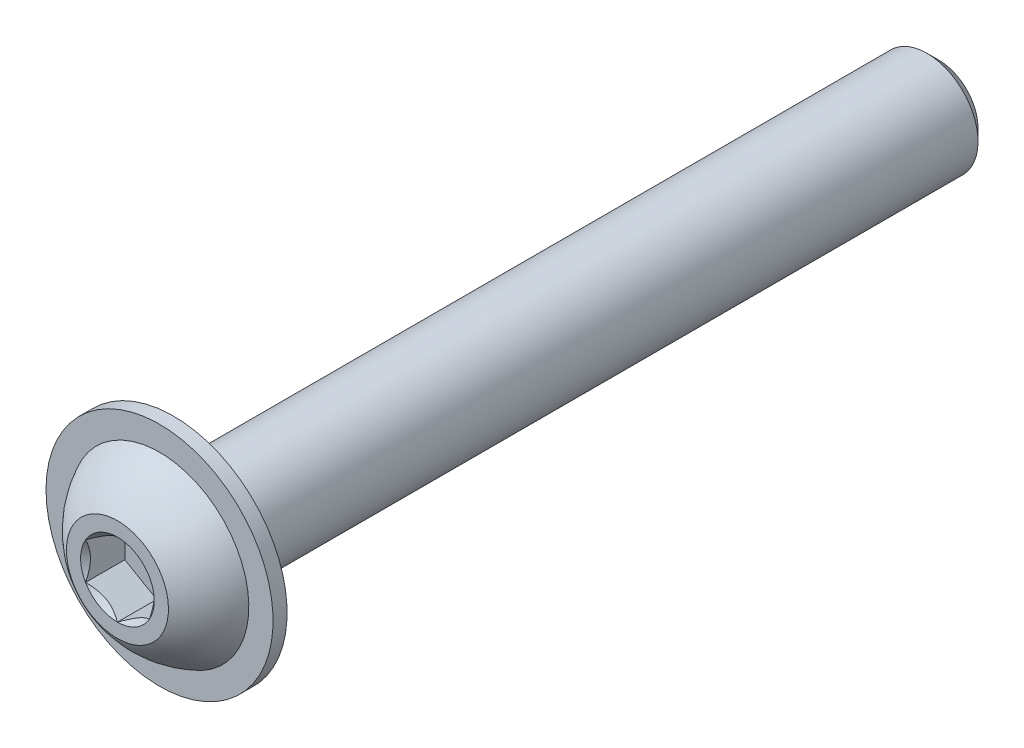
ISO-10303-21;
HEADER;
FILE_DESCRIPTION(('STEP AP214'),'2;1');
FILE_NAME('part.step','',(''),(''),'','','');
FILE_SCHEMA(('AUTOMOTIVE_DESIGN { 1 0 10303 214 1 1 1 1 }'));
ENDSEC;
DATA;
#1=APPLICATION_CONTEXT('core data for automotive mechanical design processes');
#2=APPLICATION_PROTOCOL_DEFINITION('international standard','automotive_design',2000,#1);
#3=PRODUCT_CONTEXT('',#1,'mechanical');
#4=PRODUCT('Part','Part','',(#3));
#5=PRODUCT_RELATED_PRODUCT_CATEGORY('part','',(#4));
#6=PRODUCT_DEFINITION_FORMATION('','',#4);
#7=PRODUCT_DEFINITION_CONTEXT('part definition',#1,'design');
#8=PRODUCT_DEFINITION('design','',#6,#7);
#9=PRODUCT_DEFINITION_SHAPE('','',#8);
#10=(LENGTH_UNIT() NAMED_UNIT(*) SI_UNIT(.MILLI.,.METRE.));
#11=(NAMED_UNIT(*) PLANE_ANGLE_UNIT() SI_UNIT($,.RADIAN.));
#12=(NAMED_UNIT(*) SI_UNIT($,.STERADIAN.) SOLID_ANGLE_UNIT());
#13=UNCERTAINTY_MEASURE_WITH_UNIT(LENGTH_MEASURE(1.E-05),#10,'distance_accuracy_value','');
#14=(GEOMETRIC_REPRESENTATION_CONTEXT(3) GLOBAL_UNCERTAINTY_ASSIGNED_CONTEXT((#13)) GLOBAL_UNIT_ASSIGNED_CONTEXT((#10,
#11,#12)) REPRESENTATION_CONTEXT('',''));
#15=CARTESIAN_POINT('',(0.,0.,0.));
#16=DIRECTION('',(0.,0.,1.));
#17=DIRECTION('',(1.,0.,0.));
#18=AXIS2_PLACEMENT_3D('',#15,#16,#17);
#19=CARTESIAN_POINT('',(0.,0.,-4.39999999999996));
#20=DIRECTION('',(0.,0.,-1.));
#21=DIRECTION('',(-1.,0.,0.));
#22=AXIS2_PLACEMENT_3D('',#19,#20,#21);
#23=PLANE('',#22);
#24=CARTESIAN_POINT('',(0.,0.,-4.39999999999996));
#25=DIRECTION('',(0.,0.,-1.));
#26=DIRECTION('',(-1.,0.,0.));
#27=AXIS2_PLACEMENT_3D('',#24,#25,#26);
#28=CIRCLE('',#27,8.9);
#29=CARTESIAN_POINT('',(-8.9,0.,-4.39999999999996));
#30=VERTEX_POINT('',#29);
#31=EDGE_CURVE('E134',#30,#30,#28,.T.);
#32=ORIENTED_EDGE('',*,*,#31,.T.);
#33=EDGE_LOOP('',(#32));
#34=FACE_BOUND('',#33,.T.);
#35=ADVANCED_FACE('F50',(#34),#23,.T.);
#36=CARTESIAN_POINT('',(2.49999999999994,-1.44337567297411,-3.07999999999919));
#37=DIRECTION('',(0.,0.,1.));
#38=DIRECTION('',(1.,0.,0.));
#39=AXIS2_PLACEMENT_3D('',#36,#37,#38);
#40=PLANE('',#39);
#41=DIRECTION('',(0.866025403784438,0.500000000000001,0.));
#42=VECTOR('',#41,1.);
#43=CARTESIAN_POINT('',(0.,-2.88675134594815,-3.08000000000086));
#44=LINE('',#43,#42);
#45=CARTESIAN_POINT('',(0.,-2.88675134594815,-3.08000000000086));
#46=VERTEX_POINT('',#45);
#47=CARTESIAN_POINT('',(2.49999999999994,-1.44337567297411,-3.07999999999919));
#48=VERTEX_POINT('',#47);
#49=EDGE_CURVE('E119',#46,#48,#44,.T.);
#50=ORIENTED_EDGE('',*,*,#49,.T.);
#51=DIRECTION('',(0.,0.999999999999999,0.));
#52=VECTOR('',#51,1.);
#53=CARTESIAN_POINT('',(2.49999999999994,-1.44337567297411,-3.07999999999919));
#54=LINE('',#53,#52);
#55=CARTESIAN_POINT('',(2.50000000000006,1.44337567297402,-3.08000000000086));
#56=VERTEX_POINT('',#55);
#57=EDGE_CURVE('E169',#48,#56,#54,.T.);
#58=ORIENTED_EDGE('',*,*,#57,.T.);
#59=DIRECTION('',(-0.866025403784438,0.499999999999999,0.));
#60=VECTOR('',#59,1.);
#61=CARTESIAN_POINT('',(2.50000000000006,1.44337567297402,-3.08000000000086));
#62=LINE('',#61,#60);
#63=CARTESIAN_POINT('',(0.,2.88675134594812,-3.07999999999919));
#64=VERTEX_POINT('',#63);
#65=EDGE_CURVE('E174',#56,#64,#62,.T.);
#66=ORIENTED_EDGE('',*,*,#65,.T.);
#67=DIRECTION('',(-0.866025403784439,-0.500000000000001,0.));
#68=VECTOR('',#67,1.);
#69=CARTESIAN_POINT('',(0.,2.88675134594812,-3.07999999999919));
#70=LINE('',#69,#68);
#71=CARTESIAN_POINT('',(-2.49999999999994,1.44337567297402,-3.08000000000086));
#72=VERTEX_POINT('',#71);
#73=EDGE_CURVE('E179',#64,#72,#70,.T.);
#74=ORIENTED_EDGE('',*,*,#73,.T.);
#75=DIRECTION('',(0.,-1.,0.));
#76=VECTOR('',#75,1.);
#77=CARTESIAN_POINT('',(-2.49999999999994,1.44337567297402,-3.08000000000086));
#78=LINE('',#77,#76);
#79=CARTESIAN_POINT('',(-2.50000000000006,-1.44337567297412,-3.07999999999919));
#80=VERTEX_POINT('',#79);
#81=EDGE_CURVE('E184',#72,#80,#78,.T.);
#82=ORIENTED_EDGE('',*,*,#81,.T.);
#83=DIRECTION('',(0.866025403784438,-0.499999999999999,0.));
#84=VECTOR('',#83,1.);
#85=CARTESIAN_POINT('',(-2.50000000000006,-1.44337567297412,-3.07999999999919));
#86=LINE('',#85,#84);
#87=EDGE_CURVE('E189',#80,#46,#86,.T.);
#88=ORIENTED_EDGE('',*,*,#87,.T.);
#89=EDGE_LOOP('',(#50,#58,#66,#74,#82,#88));
#90=FACE_BOUND('',#89,.T.);
#91=ADVANCED_FACE('F252',(#90),#40,.T.);
#92=CARTESIAN_POINT('',(-2.50000000000006,-1.44337567297412,-3.07999999999919));
#93=DIRECTION('',(-0.5,-0.866025403784439,0.));
#94=DIRECTION('',(0.866025403784438,-0.499999999999999,0.));
#95=AXIS2_PLACEMENT_3D('',#92,#93,#94);
#96=PLANE('',#95);
#97=DIRECTION('',(0.,0.,1.));
#98=VECTOR('',#97,1.);
#99=CARTESIAN_POINT('',(-2.50000000000006,-1.44337567297412,-3.07999999999919));
#100=LINE('',#99,#98);
#101=CARTESIAN_POINT('',(-2.50000000000006,-1.44337567297406,8.88178419700125E-13));
#102=VERTEX_POINT('',#101);
#103=EDGE_CURVE('E126',#80,#102,#100,.T.);
#104=ORIENTED_EDGE('',*,*,#103,.T.);
#105=CARTESIAN_POINT('',(-2.50020000000006,-1.44326020292023,0.000115476982642804));
#106=CARTESIAN_POINT('',(-2.41426172221242,-1.49287669073465,-0.0494592946447574));
#107=CARTESIAN_POINT('',(-2.32688643272445,-1.54332283764106,-0.0961225186372242));
#108=CARTESIAN_POINT('',(-2.14871854383449,-1.64618811625263,-0.181561859961732));
#109=CARTESIAN_POINT('',(-2.05790899931886,-1.69861703122371,-0.220290437594081));
#110=CARTESIAN_POINT('',(-1.87479587687285,-1.80433744176008,-0.286633296102172));
#111=CARTESIAN_POINT('',(-1.78253893547041,-1.85760201171341,-0.31441433146885));
#112=CARTESIAN_POINT('',(-1.59599399122351,-1.96530378549027,-0.3572168240896));
#113=CARTESIAN_POINT('',(-1.50171168743359,-2.01973769896315,-0.37227023332969));
#114=CARTESIAN_POINT('',(-1.33922174170811,-2.11355131286838,-0.385852277791261));
#115=CARTESIAN_POINT('',(-1.27122403211983,-2.15280980880349,-0.38786290075934));
#116=CARTESIAN_POINT('',(-1.1353397588308,-2.23126263056558,-0.384475882812217));
#117=CARTESIAN_POINT('',(-1.0674532424478,-2.27045692907364,-0.379075644700047));
#118=CARTESIAN_POINT('',(-0.932321211763926,-2.34847544336511,-0.361174211597508));
#119=CARTESIAN_POINT('',(-0.865076500246458,-2.3872991956613,-0.348665072953446));
#120=CARTESIAN_POINT('',(-0.7317498991818,-2.46427534467612,-0.317232498044204));
#121=CARTESIAN_POINT('',(-0.665667920900334,-2.5024277926255,-0.298309553503132));
#122=CARTESIAN_POINT('',(-0.496403653308749,-2.60015256308369,-0.242132638591765));
#123=CARTESIAN_POINT('',(-0.394270877777153,-2.65911894852994,-0.200644168403819));
#124=CARTESIAN_POINT('',(-0.244093585059642,-2.74582384890657,-0.130605953276859));
#125=CARTESIAN_POINT('',(-0.194603460117594,-2.7743969858641,-0.10599774788385));
#126=CARTESIAN_POINT('',(-0.0965399361613598,-2.83101398781789,-0.0545381132848798));
#127=CARTESIAN_POINT('',(-0.0479659965032302,-2.85905816495509,-0.0276880612209744));
#128=CARTESIAN_POINT('',(0.000200000000007486,-2.88686681600196,0.000115476980977469));
#129=B_SPLINE_CURVE_WITH_KNOTS('',3,(#105,#106,#107,#108,#109,#110,#111,#112,#113,#114,#115,
#116,#117,#118,#119,#120,#121,#122,#123,#124,#125,#126,#127,#128),.UNSPECIFIED.,.F.,.F.,(4,2,2,
2,2,2,2,2,2,2,2,4),(0.,0.333012085134134,0.667964518302078,0.997597032044016,1.32639954393906,
1.5616942414722,1.7970714210213,2.03271213522223,2.26833478775704,2.64260240809574,
2.82922877818892,3.01574133749037),.UNSPECIFIED.);
#130=CARTESIAN_POINT('',(0.,-2.88675134594812,-8.88178419700125E-13));
#131=VERTEX_POINT('',#130);
#132=EDGE_CURVE('E109',#102,#131,#129,.T.);
#133=ORIENTED_EDGE('',*,*,#132,.T.);
#134=DIRECTION('',(0.,0.,1.));
#135=VECTOR('',#134,1.);
#136=CARTESIAN_POINT('',(0.,-2.88675134594815,-3.08000000000086));
#137=LINE('',#136,#135);
#138=EDGE_CURVE('E125',#46,#131,#137,.T.);
#139=ORIENTED_EDGE('',*,*,#138,.F.);
#140=ORIENTED_EDGE('',*,*,#87,.F.);
#141=EDGE_LOOP('',(#104,#133,#139,#140));
#142=FACE_BOUND('',#141,.T.);
#143=ADVANCED_FACE('F123',(#142),#96,.F.);
#144=CARTESIAN_POINT('',(0.,-2.88675134594815,-3.08000000000086));
#145=DIRECTION('',(0.5,-0.866025403784438,0.));
#146=DIRECTION('',(0.866025403784439,0.500000000000001,0.));
#147=AXIS2_PLACEMENT_3D('',#144,#145,#146);
#148=PLANE('',#147);
#149=ORIENTED_EDGE('',*,*,#138,.T.);
#150=CARTESIAN_POINT('',(-0.000200000000004016,-2.88686681600198,0.000115476980977469));
#151=CARTESIAN_POINT('',(0.0857382777878362,-2.83725032818748,-0.0494592946456477));
#152=CARTESIAN_POINT('',(0.173113567275805,-2.78680418128109,-0.0961225186376066));
#153=CARTESIAN_POINT('',(0.351281456165468,-2.6839389026697,-0.181561859961505));
#154=CARTESIAN_POINT('',(0.442091000680801,-2.63150998769878,-0.220290437593765));
#155=CARTESIAN_POINT('',(0.625204123126512,-2.5257895771626,-0.286633296102198));
#156=CARTESIAN_POINT('',(0.717461064528956,-2.47252500720929,-0.314414331469267));
#157=CARTESIAN_POINT('',(0.904006008776035,-2.36482323343227,-0.35721682408902));
#158=CARTESIAN_POINT('',(0.998288312566142,-2.31038931995922,-0.372270233327718));
#159=CARTESIAN_POINT('',(1.16077825829178,-2.21657570605392,-0.385852277789813));
#160=CARTESIAN_POINT('',(1.22877596788008,-2.17731721011884,-0.387862900758982));
#161=CARTESIAN_POINT('',(1.36466024116917,-2.09886438835676,-0.384475882812688));
#162=CARTESIAN_POINT('',(1.43254675755221,-2.05967008984866,-0.379075644700261));
#163=CARTESIAN_POINT('',(1.56767878823603,-1.98165157555721,-0.36117421159742));
#164=CARTESIAN_POINT('',(1.63492349975341,-1.94282782326105,-0.348665072953322));
#165=CARTESIAN_POINT('',(1.76825010081808,-1.86585167424627,-0.317232498044515));
#166=CARTESIAN_POINT('',(1.83433207909964,-1.82769922629689,-0.298309553503912));
#167=CARTESIAN_POINT('',(2.00359634669133,-1.72997445583867,-0.242132638592772));
#168=CARTESIAN_POINT('',(2.10572912222276,-1.67100807039243,-0.200644168404014));
#169=CARTESIAN_POINT('',(2.25590641494045,-1.58430317001567,-0.130605953276847));
#170=CARTESIAN_POINT('',(2.30539653988266,-1.55573003305807,-0.105997747883921));
#171=CARTESIAN_POINT('',(2.40346006383899,-1.4991130311042,-0.0545381132846409));
#172=CARTESIAN_POINT('',(2.45203400349706,-1.471068853967,-0.0276880612203439));
#173=CARTESIAN_POINT('',(2.50019999999995,-1.44326020292022,0.000115476982642804));
#174=B_SPLINE_CURVE_WITH_KNOTS('',3,(#150,#151,#152,#153,#154,#155,#156,#157,#158,#159,#160,
#161,#162,#163,#164,#165,#166,#167,#168,#169,#170,#171,#172,#173),.UNSPECIFIED.,.F.,.F.,(4,2,2,
2,2,2,2,2,2,2,2,4),(0.,0.333012085133563,0.667964518300537,0.997597032042576,1.32639954393791,
1.56169424147119,1.79707142102037,2.03271213522113,2.26833478775579,2.64260240809484,
2.82922877818842,3.01574133749025),.UNSPECIFIED.);
#175=CARTESIAN_POINT('',(2.49999999999995,-1.44337567297406,8.88178419700125E-13));
#176=VERTEX_POINT('',#175);
#177=EDGE_CURVE('E115',#131,#176,#174,.T.);
#178=ORIENTED_EDGE('',*,*,#177,.T.);
#179=DIRECTION('',(0.,0.,1.));
#180=VECTOR('',#179,1.);
#181=CARTESIAN_POINT('',(2.49999999999994,-1.44337567297411,-3.07999999999919));
#182=LINE('',#181,#180);
#183=EDGE_CURVE('E72',#48,#176,#182,.T.);
#184=ORIENTED_EDGE('',*,*,#183,.F.);
#185=ORIENTED_EDGE('',*,*,#49,.F.);
#186=EDGE_LOOP('',(#149,#178,#184,#185));
#187=FACE_BOUND('',#186,.T.);
#188=ADVANCED_FACE('F130',(#187),#148,.F.);
#189=CARTESIAN_POINT('',(2.49999999999994,-1.44337567297411,-3.07999999999919));
#190=DIRECTION('',(1.,0.,0.));
#191=DIRECTION('',(0.,0.,-1.));
#192=AXIS2_PLACEMENT_3D('',#189,#190,#191);
#193=PLANE('',#192);
#194=ORIENTED_EDGE('',*,*,#183,.T.);
#195=CARTESIAN_POINT('',(2.50000000000006,-2.87868021616157,0.925964193783768));
#196=CARTESIAN_POINT('',(2.49999999999999,-2.80858751756331,0.87305476939897));
#197=CARTESIAN_POINT('',(2.49999999999996,-2.73810237384423,0.820656784806075));
#198=CARTESIAN_POINT('',(2.49999999999993,-2.59619238907427,0.71711268351496));
#199=CARTESIAN_POINT('',(2.49999999999994,-2.52476731657103,0.665966884377635));
#200=CARTESIAN_POINT('',(2.49999999999995,-2.38030019419656,0.564792497981086));
#201=CARTESIAN_POINT('',(2.49999999999994,-2.30724990359353,0.514775637784101));
#202=CARTESIAN_POINT('',(2.49999999999994,-2.1599093739724,0.416608843915115));
#203=CARTESIAN_POINT('',(2.49999999999994,-2.08561922308886,0.368458778345123));
#204=CARTESIAN_POINT('',(2.49999999999994,-1.93130274871349,0.271746559451555));
#205=CARTESIAN_POINT('',(2.49999999999994,-1.85119168497791,0.223318932536914));
#206=CARTESIAN_POINT('',(2.49999999999995,-1.68912282627113,0.129664059703774));
#207=CARTESIAN_POINT('',(2.49999999999995,-1.60716527674813,0.0844363916944372));
#208=CARTESIAN_POINT('',(2.49999999999993,-1.44137668632269,-0.00186462533096256));
#209=CARTESIAN_POINT('',(2.49999999999991,-1.35755175925743,-0.0429496273364676));
#210=CARTESIAN_POINT('',(2.49999999999997,-1.18761577759393,-0.120038133893814));
#211=CARTESIAN_POINT('',(2.50000000000006,-1.1015057792473,-0.156043939266385));
#212=CARTESIAN_POINT('',(2.50000000000005,-0.933895283730488,-0.219050255715743));
#213=CARTESIAN_POINT('',(2.49999999999997,-0.852581486652379,-0.246542279857185));
#214=CARTESIAN_POINT('',(2.49999999999992,-0.687996185051327,-0.295002885582467));
#215=CARTESIAN_POINT('',(2.49999999999994,-0.604724546085146,-0.315971017761041));
#216=CARTESIAN_POINT('',(2.49999999999994,-0.438105786501715,-0.349940004987069));
#217=CARTESIAN_POINT('',(2.49999999999991,-0.354786957377948,-0.363077366556459));
#218=CARTESIAN_POINT('',(2.49999999999997,-0.187258638268866,-0.381129805600427));
#219=CARTESIAN_POINT('',(2.50000000000006,-0.103049303891853,-0.386046296469849));
#220=CARTESIAN_POINT('',(2.50000000000005,0.0623819458554215,-0.387291925628132));
#221=CARTESIAN_POINT('',(2.49999999999997,0.143601667742384,-0.383925448289172));
#222=CARTESIAN_POINT('',(2.49999999999991,0.305344840533892,-0.369462407619159));
#223=CARTESIAN_POINT('',(2.49999999999993,0.385868223029605,-0.358365093346976));
#224=CARTESIAN_POINT('',(2.49999999999995,0.546999992477703,-0.328857921414721));
#225=CARTESIAN_POINT('',(2.49999999999994,0.627585258156358,-0.31032362316914));
#226=CARTESIAN_POINT('',(2.49999999999994,0.786991930978577,-0.266927667985993));
#227=CARTESIAN_POINT('',(2.49999999999995,0.865813485110821,-0.242066540482624));
#228=CARTESIAN_POINT('',(2.49999999999995,1.11399280220491,-0.154441088760199));
#229=CARTESIAN_POINT('',(2.49999999999994,1.27984027529457,-0.0816966645254356));
#230=CARTESIAN_POINT('',(2.49999999999994,1.52253018655039,0.0395423452677993));
#231=CARTESIAN_POINT('',(2.49999999999994,1.6025647290888,0.0820714512071594));
#232=CARTESIAN_POINT('',(2.49999999999994,1.76081489282125,0.170396524152151));
#233=CARTESIAN_POINT('',(2.49999999999994,1.83903083842888,0.216191902476673));
#234=CARTESIAN_POINT('',(2.49999999999994,1.99000684607173,0.308044678728632));
#235=CARTESIAN_POINT('',(2.49999999999994,2.06284472030453,0.353975635424464));
#236=CARTESIAN_POINT('',(2.49999999999994,2.2072716473615,0.447770245386569));
#237=CARTESIAN_POINT('',(2.49999999999994,2.2788606050042,0.495634045043718));
#238=CARTESIAN_POINT('',(2.49999999999994,2.4203707854843,0.592552236318458));
#239=CARTESIAN_POINT('',(2.49999999999994,2.49030083172911,0.641593798316324));
#240=CARTESIAN_POINT('',(2.49999999999994,2.62920524991591,0.740973835190053));
#241=CARTESIAN_POINT('',(2.49999999999994,2.69817987937865,0.79131194970785));
#242=CARTESIAN_POINT('',(2.49999999999994,2.76675463365828,0.842180297683237));
#243=B_SPLINE_CURVE_WITH_KNOTS('',3,(#195,#196,#197,#198,#199,#200,#201,#202,#203,#204,#205,
#206,#207,#208,#209,#210,#211,#212,#213,#214,#215,#216,#217,#218,#219,#220,#221,#222,#223,#224,
#225,#226,#227,#228,#229,#230,#231,#232,#233,#234,#235,#236,#237,#238,#239,#240,#241,#242),
.UNSPECIFIED.,.F.,.F.,(4,2,2,2,2,2,2,2,2,2,2,2,2,2,2,2,2,2,2,2,2,2,2,4),(0.,0.263465914971095,
0.526997968323226,0.792571943279485,1.05812711983795,1.33890112548036,1.61963802629089,
1.89956181222213,2.17935838571874,2.43663887682564,2.69393708705202,2.94660788173085,
3.19923523084959,3.44271854486734,3.68622551313313,3.93398926860529,4.18173229781925,
4.72334004841866,4.99521600381973,5.26704308216925,5.52534341671965,5.78366335141071,
6.03988492204045,6.29603603207553),.UNSPECIFIED.);
#244=CARTESIAN_POINT('',(2.50000000000006,1.44337567297406,-8.88178419700125E-13));
#245=VERTEX_POINT('',#244);
#246=EDGE_CURVE('E233',#176,#245,#243,.T.);
#247=ORIENTED_EDGE('',*,*,#246,.T.);
#248=DIRECTION('',(0.,0.,1.));
#249=VECTOR('',#248,1.);
#250=CARTESIAN_POINT('',(2.50000000000006,1.44337567297402,-3.08000000000086));
#251=LINE('',#250,#249);
#252=EDGE_CURVE('E196',#56,#245,#251,.T.);
#253=ORIENTED_EDGE('',*,*,#252,.F.);
#254=ORIENTED_EDGE('',*,*,#57,.F.);
#255=EDGE_LOOP('',(#194,#247,#253,#254));
#256=FACE_BOUND('',#255,.T.);
#257=ADVANCED_FACE('F244',(#256),#193,.F.);
#258=CARTESIAN_POINT('',(2.50000000000006,1.44337567297402,-3.08000000000086));
#259=DIRECTION('',(0.5,0.866025403784439,0.));
#260=DIRECTION('',(-0.866025403784438,0.499999999999999,0.));
#261=AXIS2_PLACEMENT_3D('',#258,#259,#260);
#262=PLANE('',#261);
#263=ORIENTED_EDGE('',*,*,#252,.T.);
#264=CARTESIAN_POINT('',(2.50020000000007,1.44326020292023,0.000115476980866447));
#265=CARTESIAN_POINT('',(2.41426172221215,1.49287669073475,-0.0494592946457352));
#266=CARTESIAN_POINT('',(2.32688643272411,1.54332283764118,-0.0961225186376951));
#267=CARTESIAN_POINT('',(2.14871854383435,1.64618811625261,-0.181561859961604));
#268=CARTESIAN_POINT('',(2.05790899931898,1.69861703122354,-0.220290437593875));
#269=CARTESIAN_POINT('',(1.87479587687328,1.80433744175974,-0.286633296102302));
#270=CARTESIAN_POINT('',(1.78253893547087,1.85760201171306,-0.314414331469361));
#271=CARTESIAN_POINT('',(1.59599399122381,1.96530378549,-0.35721682408906));
#272=CARTESIAN_POINT('',(1.50171168743367,2.01973769896296,-0.372270233327713));
#273=CARTESIAN_POINT('',(1.33922174170805,2.11355131286828,-0.385852277789819));
#274=CARTESIAN_POINT('',(1.27122403211977,2.15280980880342,-0.387862900759017));
#275=CARTESIAN_POINT('',(1.13533975883072,2.23126263056555,-0.384475882812703));
#276=CARTESIAN_POINT('',(1.06745324244768,2.27045692907362,-0.379075644700227));
#277=CARTESIAN_POINT('',(0.932321211763826,2.34847544336507,-0.361174211597474));
#278=CARTESIAN_POINT('',(0.865076500246401,2.38729919566126,-0.34866507295351));
#279=CARTESIAN_POINT('',(0.731749899181784,2.46427534467602,-0.317232498044303));
#280=CARTESIAN_POINT('',(0.665667920900319,2.50242779262536,-0.298309553503165));
#281=CARTESIAN_POINT('',(0.496403653308683,2.60015256308355,-0.242132638591685));
#282=CARTESIAN_POINT('',(0.394270877777059,2.65911894852989,-0.200644168403733));
#283=CARTESIAN_POINT('',(0.244093585059356,2.74582384890665,-0.130605953276888));
#284=CARTESIAN_POINT('',(0.194603460117203,2.77439698586422,-0.105997747883929));
#285=CARTESIAN_POINT('',(0.0965399361609544,2.83101398781804,-0.0545381132845752));
#286=CARTESIAN_POINT('',(0.0479659965029141,2.85905816495521,-0.0276880612202363));
#287=CARTESIAN_POINT('',(-0.000200000000002282,2.88686681600198,0.000115476982642804));
#288=B_SPLINE_CURVE_WITH_KNOTS('',3,(#264,#265,#266,#267,#268,#269,#270,#271,#272,#273,#274,
#275,#276,#277,#278,#279,#280,#281,#282,#283,#284,#285,#286,#287),.UNSPECIFIED.,.F.,.F.,(4,2,2,
2,2,2,2,2,2,2,2,4),(0.,0.333012085133761,0.667964518300852,0.997597032042777,1.32639954393805,
1.56169424147136,1.79707142102051,2.03271213522132,2.26833478775608,2.64260240809503,
2.82922877818846,3.01574133749022),.UNSPECIFIED.);
#289=CARTESIAN_POINT('',(0.,2.88675134594815,8.88178419700125E-13));
#290=VERTEX_POINT('',#289);
#291=EDGE_CURVE('E153',#245,#290,#288,.T.);
#292=ORIENTED_EDGE('',*,*,#291,.T.);
#293=DIRECTION('',(0.,0.,1.));
#294=VECTOR('',#293,1.);
#295=CARTESIAN_POINT('',(0.,2.88675134594812,-3.07999999999919));
#296=LINE('',#295,#294);
#297=EDGE_CURVE('E201',#64,#290,#296,.T.);
#298=ORIENTED_EDGE('',*,*,#297,.F.);
#299=ORIENTED_EDGE('',*,*,#65,.F.);
#300=EDGE_LOOP('',(#263,#292,#298,#299));
#301=FACE_BOUND('',#300,.T.);
#302=ADVANCED_FACE('F290',(#301),#262,.F.);
#303=CARTESIAN_POINT('',(0.,2.88675134594812,-3.07999999999919));
#304=DIRECTION('',(-0.5,0.866025403784438,0.));
#305=DIRECTION('',(-0.866025403784439,-0.500000000000001,0.));
#306=AXIS2_PLACEMENT_3D('',#303,#304,#305);
#307=PLANE('',#306);
#308=ORIENTED_EDGE('',*,*,#297,.T.);
#309=CARTESIAN_POINT('',(0.000200000000007486,2.88686681600198,0.000115476982642804));
#310=CARTESIAN_POINT('',(-0.0857382777876307,2.83725032818759,-0.0494592946448085));
#311=CARTESIAN_POINT('',(-0.173113567275586,2.78680418128119,-0.09612251863729));
#312=CARTESIAN_POINT('',(-0.351281456165514,2.68393890266963,-0.181561859961799));
#313=CARTESIAN_POINT('',(-0.44209100068113,2.63150998769855,-0.220290437594136));
#314=CARTESIAN_POINT('',(-0.625204123127131,2.52578957716222,-0.286633296102232));
#315=CARTESIAN_POINT('',(-0.717461064529571,2.47252500720894,-0.314414331468926));
#316=CARTESIAN_POINT('',(-0.904006008776392,2.364823233432,-0.357216824089638));
#317=CARTESIAN_POINT('',(-0.998288312566245,2.31038931995901,-0.372270233329672));
#318=CARTESIAN_POINT('',(-1.16077825829175,2.21657570605382,-0.385852277791275));
#319=CARTESIAN_POINT('',(-1.22877596788009,2.17731721011879,-0.387862900759404));
#320=CARTESIAN_POINT('',(-1.36466024116917,2.09886438835675,-0.384475882812317));
#321=CARTESIAN_POINT('',(-1.43254675755217,2.05967008984865,-0.379075644700134));
#322=CARTESIAN_POINT('',(-1.56767878823605,1.98165157555717,-0.361174211597597));
#323=CARTESIAN_POINT('',(-1.63492349975355,1.942827823261,-0.34866507295355));
#324=CARTESIAN_POINT('',(-1.76825010081819,1.86585167424612,-0.317232498044273));
#325=CARTESIAN_POINT('',(-1.83433207909961,1.82769922629666,-0.298309553503148));
#326=CARTESIAN_POINT('',(-2.00359634669117,1.72997445583843,-0.242132638591747));
#327=CARTESIAN_POINT('',(-2.10572912222285,1.67100807039229,-0.20064416840388));
#328=CARTESIAN_POINT('',(-2.25590641494038,1.58430317001571,-0.130605953276951));
#329=CARTESIAN_POINT('',(-2.30539653988243,1.55573003305819,-0.105997747883939));
#330=CARTESIAN_POINT('',(-2.40346006383863,1.49911303110436,-0.0545381132849667));
#331=CARTESIAN_POINT('',(-2.45203400349674,1.47106885396713,-0.027688061221063));
#332=CARTESIAN_POINT('',(-2.50019999999995,1.44326020292021,0.000115476980866447));
#333=B_SPLINE_CURVE_WITH_KNOTS('',3,(#309,#310,#311,#312,#313,#314,#315,#316,#317,#318,#319,
#320,#321,#322,#323,#324,#325,#326,#327,#328,#329,#330,#331,#332),.UNSPECIFIED.,.F.,.F.,(4,2,2,
2,2,2,2,2,2,2,2,4),(0.,0.333012085134117,0.667964518302013,0.997597032043898,1.32639954393891,
1.56169424147209,1.79707142102122,2.03271213522218,2.26833478775702,2.6426024080957,
2.82922877818886,3.0157413374903),.UNSPECIFIED.);
#334=CARTESIAN_POINT('',(-2.49999999999994,1.44337567297405,-8.88178419700125E-13));
#335=VERTEX_POINT('',#334);
#336=EDGE_CURVE('E157',#290,#335,#333,.T.);
#337=ORIENTED_EDGE('',*,*,#336,.T.);
#338=DIRECTION('',(0.,0.,1.));
#339=VECTOR('',#338,1.);
#340=CARTESIAN_POINT('',(-2.49999999999994,1.44337567297402,-3.08000000000086));
#341=LINE('',#340,#339);
#342=EDGE_CURVE('E206',#72,#335,#341,.T.);
#343=ORIENTED_EDGE('',*,*,#342,.F.);
#344=ORIENTED_EDGE('',*,*,#73,.F.);
#345=EDGE_LOOP('',(#308,#337,#343,#344));
#346=FACE_BOUND('',#345,.T.);
#347=ADVANCED_FACE('F286',(#346),#307,.F.);
#348=CARTESIAN_POINT('',(-2.49999999999994,1.44337567297402,-3.08000000000086));
#349=DIRECTION('',(-1.,0.,0.));
#350=DIRECTION('',(0.,-1.,0.));
#351=AXIS2_PLACEMENT_3D('',#348,#349,#350);
#352=PLANE('',#351);
#353=ORIENTED_EDGE('',*,*,#342,.T.);
#354=CARTESIAN_POINT('',(-2.49999999999994,-2.87868021616159,0.925964193783768));
#355=CARTESIAN_POINT('',(-2.49999999999994,-2.80858751756333,0.873054769398975));
#356=CARTESIAN_POINT('',(-2.49999999999994,-2.73810237384425,0.820656784806082));
#357=CARTESIAN_POINT('',(-2.49999999999994,-2.59619238907428,0.717112683514967));
#358=CARTESIAN_POINT('',(-2.49999999999994,-2.52476731657104,0.66596688437764));
#359=CARTESIAN_POINT('',(-2.49999999999994,-2.38030019419657,0.56479249798109));
#360=CARTESIAN_POINT('',(-2.49999999999994,-2.30724990359354,0.514775637784104));
#361=CARTESIAN_POINT('',(-2.49999999999994,-2.1599093739724,0.416608843915117));
#362=CARTESIAN_POINT('',(-2.49999999999994,-2.08561922308886,0.368458778345125));
#363=CARTESIAN_POINT('',(-2.49999999999994,-1.93130274871349,0.271746559451556));
#364=CARTESIAN_POINT('',(-2.49999999999994,-1.85119168497791,0.223318932536915));
#365=CARTESIAN_POINT('',(-2.49999999999994,-1.68912282627113,0.129664059703773));
#366=CARTESIAN_POINT('',(-2.49999999999994,-1.60716527674813,0.0844363916944359));
#367=CARTESIAN_POINT('',(-2.49999999999994,-1.44137668632268,-0.00186462533096573));
#368=CARTESIAN_POINT('',(-2.49999999999994,-1.35755175925742,-0.0429496273364722));
#369=CARTESIAN_POINT('',(-2.49999999999994,-1.18761577759392,-0.120038133893817));
#370=CARTESIAN_POINT('',(-2.49999999999994,-1.10150577924729,-0.156043939266385));
#371=CARTESIAN_POINT('',(-2.49999999999994,-0.933895283730474,-0.219050255715742));
#372=CARTESIAN_POINT('',(-2.49999999999994,-0.852581486652367,-0.246542279857187));
#373=CARTESIAN_POINT('',(-2.49999999999994,-0.687996185051317,-0.295002885582471));
#374=CARTESIAN_POINT('',(-2.49999999999994,-0.604724546085136,-0.315971017761044));
#375=CARTESIAN_POINT('',(-2.49999999999994,-0.438105786501706,-0.349940004987069));
#376=CARTESIAN_POINT('',(-2.49999999999994,-0.354786957377941,-0.363077366556458));
#377=CARTESIAN_POINT('',(-2.49999999999994,-0.187258638268861,-0.381129805600427));
#378=CARTESIAN_POINT('',(-2.49999999999994,-0.103049303891848,-0.38604629646985));
#379=CARTESIAN_POINT('',(-2.49999999999994,0.0623819458554237,-0.387291925628132));
#380=CARTESIAN_POINT('',(-2.49999999999994,0.143601667742385,-0.38392544828917));
#381=CARTESIAN_POINT('',(-2.49999999999994,0.30534484053389,-0.369462407619157));
#382=CARTESIAN_POINT('',(-2.49999999999994,0.385868223029602,-0.358365093346974));
#383=CARTESIAN_POINT('',(-2.49999999999994,0.546999992477698,-0.32885792141472));
#384=CARTESIAN_POINT('',(-2.49999999999994,0.627585258156352,-0.310323623169139));
#385=CARTESIAN_POINT('',(-2.49999999999994,0.786991930978569,-0.266927667985992));
#386=CARTESIAN_POINT('',(-2.49999999999994,0.865813485110812,-0.242066540482624));
#387=CARTESIAN_POINT('',(-2.49999999999995,1.1139928022049,-0.154441088760199));
#388=CARTESIAN_POINT('',(-2.49999999999994,1.27984027529456,-0.0816966645254353));
#389=CARTESIAN_POINT('',(-2.49999999999994,1.52253018655038,0.0395423452677995));
#390=CARTESIAN_POINT('',(-2.49999999999995,1.60256472908879,0.0820714512071598));
#391=CARTESIAN_POINT('',(-2.49999999999995,1.76081489282125,0.170396524152151));
#392=CARTESIAN_POINT('',(-2.49999999999995,1.83903083842887,0.216191902476674));
#393=CARTESIAN_POINT('',(-2.49999999999995,1.99000684607172,0.308044678728634));
#394=CARTESIAN_POINT('',(-2.49999999999994,2.06284472030453,0.353975635424465));
#395=CARTESIAN_POINT('',(-2.49999999999995,2.2072716473615,0.44777024538657));
#396=CARTESIAN_POINT('',(-2.49999999999995,2.2788606050042,0.495634045043719));
#397=CARTESIAN_POINT('',(-2.49999999999994,2.42037078548429,0.592552236318459));
#398=CARTESIAN_POINT('',(-2.49999999999994,2.49030083172911,0.641593798316325));
#399=CARTESIAN_POINT('',(-2.49999999999996,2.6292052499159,0.740973835190054));
#400=CARTESIAN_POINT('',(-2.49999999999999,2.69817987937865,0.79131194970785));
#401=CARTESIAN_POINT('',(-2.50000000000006,2.76675463365827,0.842180297683237));
#402=B_SPLINE_CURVE_WITH_KNOTS('',3,(#354,#355,#356,#357,#358,#359,#360,#361,#362,#363,#364,
#365,#366,#367,#368,#369,#370,#371,#372,#373,#374,#375,#376,#377,#378,#379,#380,#381,#382,#383,
#384,#385,#386,#387,#388,#389,#390,#391,#392,#393,#394,#395,#396,#397,#398,#399,#400,#401),
.UNSPECIFIED.,.F.,.F.,(4,2,2,2,2,2,2,2,2,2,2,2,2,2,2,2,2,2,2,2,2,2,2,4),(0.,0.263465914971097,
0.526997968323232,0.792571943279493,1.05812711983796,1.33890112548038,1.61963802629091,
1.89956181222216,2.17935838571877,2.43663887682567,2.69393708705205,2.94660788173087,
3.19923523084961,3.44271854486736,3.68622551313314,3.93398926860529,4.18173229781926,
4.72334004841867,4.99521600381974,5.26704308216927,5.52534341671967,5.78366335141072,
6.03988492204046,6.29603603207554),.UNSPECIFIED.);
#403=EDGE_CURVE('E128',#335,#102,#402,.F.);
#404=ORIENTED_EDGE('',*,*,#403,.T.);
#405=ORIENTED_EDGE('',*,*,#103,.F.);
#406=ORIENTED_EDGE('',*,*,#81,.F.);
#407=EDGE_LOOP('',(#353,#404,#405,#406));
#408=FACE_BOUND('',#407,.T.);
#409=ADVANCED_FACE('F283',(#408),#352,.F.);
#410=CARTESIAN_POINT('',(0.,0.,0.));
#411=DIRECTION('',(0.,0.,1.));
#412=DIRECTION('',(1.,0.,0.));
#413=AXIS2_PLACEMENT_3D('',#410,#411,#412);
#414=CONICAL_SURFACE('',#413,2.88675134594813,0.78539816339745);
#415=CARTESIAN_POINT('',(0.,0.,0.));
#416=DIRECTION('',(0.,0.,1.));
#417=DIRECTION('',(1.,0.,0.));
#418=AXIS2_PLACEMENT_3D('',#415,#416,#417);
#419=CIRCLE('',#418,2.88675134594813);
#420=EDGE_CURVE('E106',#102,#131,#419,.T.);
#421=ORIENTED_EDGE('',*,*,#420,.T.);
#422=ORIENTED_EDGE('',*,*,#132,.F.);
#423=EDGE_LOOP('',(#421,#422));
#424=FACE_BOUND('',#423,.T.);
#425=ADVANCED_FACE('F107',(#424),#414,.F.);
#426=EDGE_CURVE('E59',#131,#176,#419,.T.);
#427=ORIENTED_EDGE('',*,*,#426,.T.);
#428=ORIENTED_EDGE('',*,*,#177,.F.);
#429=EDGE_LOOP('',(#427,#428));
#430=FACE_BOUND('',#429,.T.);
#431=ADVANCED_FACE('F116',(#430),#414,.F.);
#432=EDGE_CURVE('E13',#176,#245,#419,.T.);
#433=ORIENTED_EDGE('',*,*,#432,.T.);
#434=ORIENTED_EDGE('',*,*,#246,.F.);
#435=EDGE_LOOP('',(#433,#434));
#436=FACE_BOUND('',#435,.T.);
#437=ADVANCED_FACE('F251',(#436),#414,.F.);
#438=EDGE_CURVE('E53',#245,#290,#419,.T.);
#439=ORIENTED_EDGE('',*,*,#438,.T.);
#440=ORIENTED_EDGE('',*,*,#291,.F.);
#441=EDGE_LOOP('',(#439,#440));
#442=FACE_BOUND('',#441,.T.);
#443=ADVANCED_FACE('F315',(#442),#414,.F.);
#444=EDGE_CURVE('E147',#290,#335,#419,.T.);
#445=ORIENTED_EDGE('',*,*,#444,.T.);
#446=ORIENTED_EDGE('',*,*,#336,.F.);
#447=EDGE_LOOP('',(#445,#446));
#448=FACE_BOUND('',#447,.T.);
#449=ADVANCED_FACE('F313',(#448),#414,.F.);
#450=EDGE_CURVE('E114',#335,#102,#419,.T.);
#451=ORIENTED_EDGE('',*,*,#450,.T.);
#452=ORIENTED_EDGE('',*,*,#403,.F.);
#453=EDGE_LOOP('',(#451,#452));
#454=FACE_BOUND('',#453,.T.);
#455=ADVANCED_FACE('F309',(#454),#414,.F.);
#456=CARTESIAN_POINT('',(0.,-4.00000000000001,8.88178419700125E-13));
#457=DIRECTION('',(0.,0.,-1.));
#458=DIRECTION('',(-1.,0.,0.));
#459=AXIS2_PLACEMENT_3D('',#456,#457,#458);
#460=PLANE('',#459);
#461=ORIENTED_EDGE('',*,*,#450,.F.);
#462=ORIENTED_EDGE('',*,*,#444,.F.);
#463=ORIENTED_EDGE('',*,*,#438,.F.);
#464=ORIENTED_EDGE('',*,*,#432,.F.);
#465=ORIENTED_EDGE('',*,*,#426,.F.);
#466=ORIENTED_EDGE('',*,*,#420,.F.);
#467=EDGE_LOOP('',(#461,#462,#463,#464,#465,#466));
#468=FACE_BOUND('',#467,.T.);
#469=CARTESIAN_POINT('',(0.,0.,0.));
#470=DIRECTION('',(0.,0.,1.));
#471=DIRECTION('',(1.,0.,0.));
#472=AXIS2_PLACEMENT_3D('',#469,#470,#471);
#473=CIRCLE('',#472,4.);
#474=CARTESIAN_POINT('',(0.,-3.99999999999992,0.));
#475=VERTEX_POINT('',#474);
#476=EDGE_CURVE('E228',#475,#475,#473,.T.);
#477=ORIENTED_EDGE('',*,*,#476,.T.);
#478=EDGE_LOOP('',(#477));
#479=FACE_BOUND('',#478,.T.);
#480=ADVANCED_FACE('F137',(#468,#479),#460,.F.);
#481=CARTESIAN_POINT('',(0.,0.,-6.65000000000004));
#482=DIRECTION('',(0.,0.,1.));
#483=DIRECTION('',(0.,-1.,0.));
#484=AXIS2_PLACEMENT_3D('',#481,#482,#483);
#485=SPHERICAL_SURFACE('',#484,7.76031571522705);
#486=CARTESIAN_POINT('',(0.,0.,-3.29999999999997));
#487=DIRECTION('',(0.,0.,-1.));
#488=DIRECTION('',(-1.,0.,0.));
#489=AXIS2_PLACEMENT_3D('',#486,#487,#488);
#490=CIRCLE('',#489,7.);
#491=CARTESIAN_POINT('',(0.,-6.99999999999996,-3.29999999999997));
#492=VERTEX_POINT('',#491);
#493=EDGE_CURVE('E223',#492,#492,#490,.T.);
#494=CARTESIAN_POINT('',(0.,-3.99999999999992,0.));
#495=CARTESIAN_POINT('',(0.,-4.04037893719837,-0.0242880228539719));
#496=CARTESIAN_POINT('',(0.,-4.08053660493605,-0.0489439030561385));
#497=CARTESIAN_POINT('',(0.,-4.16039619582756,-0.0989830066171529));
#498=CARTESIAN_POINT('',(0.,-4.20009811898139,-0.124366229976001));
#499=CARTESIAN_POINT('',(0.,-4.2790330150429,-0.175851648310668));
#500=CARTESIAN_POINT('',(0.,-4.31826598795057,-0.201953843286488));
#501=CARTESIAN_POINT('',(0.,-4.39624997398239,-0.254868530081801));
#502=CARTESIAN_POINT('',(0.,-4.43500098710654,-0.281681021901294));
#503=CARTESIAN_POINT('',(0.,-4.51200819309826,-0.336007409250989));
#504=CARTESIAN_POINT('',(0.,-4.55026438596583,-0.363521304781191));
#505=CARTESIAN_POINT('',(0.,-4.62626925806947,-0.419241369039924));
#506=CARTESIAN_POINT('',(0.,-4.66401793730553,-0.447447537768455));
#507=CARTESIAN_POINT('',(0.,-4.73899525639249,-0.504542789448706));
#508=CARTESIAN_POINT('',(0.,-4.77622389624339,-0.533431872400426));
#509=CARTESIAN_POINT('',(0.,-4.85014878357225,-0.591883366617189));
#510=CARTESIAN_POINT('',(0.,-4.88684503105021,-0.621445777882232));
#511=CARTESIAN_POINT('',(0.,-4.95969295724539,-0.681234119484464));
#512=CARTESIAN_POINT('',(0.,-4.99584463596261,-0.711460049821651));
#513=CARTESIAN_POINT('',(0.,-5.06759142895973,-0.772565400137289));
#514=CARTESIAN_POINT('',(0.,-5.10318654323964,-0.803444820115738));
#515=CARTESIAN_POINT('',(0.,-5.17380839635813,-0.865846903451575));
#516=CARTESIAN_POINT('',(0.,-5.20883513519672,-0.897369566808963));
#517=CARTESIAN_POINT('',(0.,-5.27830861502532,-0.961047677200643));
#518=CARTESIAN_POINT('',(0.,-5.31275535601533,-0.993203124234936));
#519=CARTESIAN_POINT('',(0.,-5.38105741019139,-1.05813613231156));
#520=CARTESIAN_POINT('',(0.,-5.41491272337744,-1.09091369335389));
#521=CARTESIAN_POINT('',(0.,-5.48202068823502,-1.15708005335065));
#522=CARTESIAN_POINT('',(0.,-5.51527333990657,-1.19046885230509));
#523=CARTESIAN_POINT('',(0.,-5.58116494799691,-1.25784660921207));
#524=CARTESIAN_POINT('',(0.,-5.61380390441571,-1.29183556716462));
#525=CARTESIAN_POINT('',(0.,-5.67845729189579,-1.36040236401192));
#526=CARTESIAN_POINT('',(0.,-5.71047172295708,-1.39498020290667));
#527=CARTESIAN_POINT('',(0.,-5.77386543684441,-1.46471328818274));
#528=CARTESIAN_POINT('',(0.,-5.80524471967046,-1.49986853456406));
#529=CARTESIAN_POINT('',(0.,-5.86735772496153,-1.57074476976501));
#530=CARTESIAN_POINT('',(0.,-5.89809144742654,-1.60646575858465));
#531=CARTESIAN_POINT('',(0.,-5.95890313407649,-1.67846162589199));
#532=CARTESIAN_POINT('',(0.,-5.98898109826144,-1.71473650437969));
#533=CARTESIAN_POINT('',(0.,-6.04847128802288,-1.78782811446386));
#534=CARTESIAN_POINT('',(0.,-6.07788351359938,-1.82464484606033));
#535=CARTESIAN_POINT('',(0.,-6.13603246671775,-1.89880794600757));
#536=CARTESIAN_POINT('',(0.,-6.16476919425962,-1.93615431435836));
#537=CARTESIAN_POINT('',(0.,-6.22155761602329,-2.01136429571816));
#538=CARTESIAN_POINT('',(0.,-6.24960931024507,-2.04922790872719));
#539=CARTESIAN_POINT('',(0.,-6.30501835738714,-2.12545981567796));
#540=CARTESIAN_POINT('',(0.,-6.33237571030741,-2.16382810961971));
#541=CARTESIAN_POINT('',(0.,-6.38638699725991,-2.24105664724864));
#542=CARTESIAN_POINT('',(0.,-6.41304093129213,-2.27991689093583));
#543=CARTESIAN_POINT('',(0.,-6.46563653628033,-2.35811643363532));
#544=CARTESIAN_POINT('',(0.,-6.49157820723631,-2.39745573264761));
#545=CARTESIAN_POINT('',(0.,-6.5427406782489,-2.47660033260644));
#546=CARTESIAN_POINT('',(0.,-6.5679614783055,-2.51640563355297));
#547=CARTESIAN_POINT('',(0.,-6.61767383879795,-2.59646902941006));
#548=CARTESIAN_POINT('',(0.,-6.64216539923378,-2.63672712432062));
#549=CARTESIAN_POINT('',(0.,-6.69041115408783,-2.71768274971534));
#550=CARTESIAN_POINT('',(0.,-6.71416534850605,-2.7583802801995));
#551=CARTESIAN_POINT('',(0.,-6.76092848828481,-2.84020127319734));
#552=CARTESIAN_POINT('',(0.,-6.78393743364536,-2.88132473571101));
#553=CARTESIAN_POINT('',(0.,-6.82920244445215,-2.96398394543817));
#554=CARTESIAN_POINT('',(0.,-6.8514585098984,-3.00551969265166));
#555=CARTESIAN_POINT('',(0.,-6.89521036155602,-3.08898969680803));
#556=CARTESIAN_POINT('',(0.,-6.91670614776741,-3.13092395375092));
#557=CARTESIAN_POINT('',(0.,-6.95893036213258,-3.21517703597225));
#558=CARTESIAN_POINT('',(0.,-6.97965879028636,-3.25749586125068));
#559=CARTESIAN_POINT('',(0.,-6.99999999999996,-3.29999999999997));
#560=B_SPLINE_CURVE_WITH_KNOTS('',3,(#494,#495,#496,#497,#498,#499,#500,#501,#502,#503,#504,
#505,#506,#507,#508,#509,#510,#511,#512,#513,#514,#515,#516,#517,#518,#519,#520,#521,#522,#523,
#524,#525,#526,#527,#528,#529,#530,#531,#532,#533,#534,#535,#536,#537,#538,#539,#540,#541,#542,
#543,#544,#545,#546,#547,#548,#549,#550,#551,#552,#553,#554,#555,#556,#557,#558,#559),
.UNSPECIFIED.,.F.,.F.,(4,2,2,2,2,2,2,2,2,2,2,2,2,2,2,2,2,2,2,2,2,2,2,2,2,2,2,2,2,2,2,2,4),(0.,
0.141360341936276,0.282720683872553,0.424081025808828,0.565441367745104,0.706801709681382,
0.848162051617657,0.989522393553933,1.13088273549021,1.27224307742649,1.41360341936276,
1.55496376129904,1.69632410323531,1.83768444517159,1.97904478710787,2.12040512904414,
2.26176547098042,2.40312581291669,2.54448615485297,2.68584649678925,2.82720683872552,
2.9685671806618,3.10992752259807,3.25128786453435,3.39264820647063,3.5340085484069,
3.67536889034318,3.81672923227945,3.95808957421573,4.09944991615201,4.24081025808828,
4.38217060002456,4.52353094196084),.UNSPECIFIED.);
#561=EDGE_CURVE('BSEAM330',#475,#492,#560,.T.);
#562=ORIENTED_EDGE('',*,*,#476,.F.);
#563=ORIENTED_EDGE('',*,*,#493,.F.);
#564=ORIENTED_EDGE('',*,*,#561,.T.);
#565=ORIENTED_EDGE('',*,*,#561,.F.);
#566=EDGE_LOOP('',(#562,#564,#563,#565));
#567=FACE_BOUND('',#566,.T.);
#568=ADVANCED_FACE('F330',(#567),#485,.T.);
#569=CARTESIAN_POINT('',(0.,0.,-3.29999999999997));
#570=DIRECTION('',(0.,0.,-1.));
#571=DIRECTION('',(-1.,0.,0.));
#572=AXIS2_PLACEMENT_3D('',#569,#570,#571);
#573=PLANE('',#572);
#574=CARTESIAN_POINT('',(0.,0.,-3.29999999999997));
#575=DIRECTION('',(0.,0.,-1.));
#576=DIRECTION('',(-1.,0.,0.));
#577=AXIS2_PLACEMENT_3D('',#574,#575,#576);
#578=CIRCLE('',#577,8.9);
#579=CARTESIAN_POINT('',(-8.9,0.,-3.29999999999997));
#580=VERTEX_POINT('',#579);
#581=EDGE_CURVE('E218',#580,#580,#578,.T.);
#582=ORIENTED_EDGE('',*,*,#581,.F.);
#583=EDGE_LOOP('',(#582));
#584=FACE_BOUND('',#583,.T.);
#585=ORIENTED_EDGE('',*,*,#493,.T.);
#586=EDGE_LOOP('',(#585));
#587=FACE_BOUND('',#586,.T.);
#588=ADVANCED_FACE('F373',(#584,#587),#573,.F.);
#589=CARTESIAN_POINT('',(0.,0.,-3.29999999999997));
#590=DIRECTION('',(0.,0.,-1.));
#591=DIRECTION('',(-1.,0.,0.));
#592=AXIS2_PLACEMENT_3D('',#589,#590,#591);
#593=CYLINDRICAL_SURFACE('',#592,8.9);
#594=ORIENTED_EDGE('',*,*,#581,.T.);
#595=EDGE_LOOP('',(#594));
#596=FACE_BOUND('',#595,.T.);
#597=ORIENTED_EDGE('',*,*,#31,.F.);
#598=EDGE_LOOP('',(#597));
#599=FACE_BOUND('',#598,.T.);
#600=ADVANCED_FACE('F304',(#596,#599),#593,.T.);
#601=CLOSED_SHELL('',(#35,#91,#143,#188,#257,#302,#347,#409,#425,#431,#437,#443,#449,#455,#480,
#568,#588,#600));
#602=MANIFOLD_SOLID_BREP('B2',#601);
#603=CARTESIAN_POINT('',(0.,0.,-4.39999999999996));
#604=DIRECTION('',(0.,0.,-1.));
#605=DIRECTION('',(-1.,0.,0.));
#606=AXIS2_PLACEMENT_3D('',#603,#604,#605);
#607=PLANE('',#606);
#608=CARTESIAN_POINT('',(0.,0.,-4.39999999999996));
#609=DIRECTION('',(0.,0.,1.));
#610=DIRECTION('',(1.,0.,0.));
#611=AXIS2_PLACEMENT_3D('',#608,#609,#610);
#612=CIRCLE('',#611,4.);
#613=CARTESIAN_POINT('',(4.,0.,-4.39999999999996));
#614=VERTEX_POINT('',#613);
#615=EDGE_CURVE('E471',#614,#614,#612,.F.);
#616=ORIENTED_EDGE('',*,*,#615,.F.);
#617=EDGE_LOOP('',(#616));
#618=FACE_BOUND('',#617,.T.);
#619=ADVANCED_FACE('F458',(#618),#607,.F.);
#620=CARTESIAN_POINT('',(0.,-4.0000000000001,-64.3999999999991));
#621=DIRECTION('',(0.,0.,-1.));
#622=DIRECTION('',(0.,1.,0.));
#623=AXIS2_PLACEMENT_3D('',#620,#621,#622);
#624=PLANE('',#623);
#625=CARTESIAN_POINT('',(0.,-1.11022302462516E-13,-64.4));
#626=DIRECTION('',(0.,0.,-1.));
#627=DIRECTION('',(0.,1.,0.));
#628=AXIS2_PLACEMENT_3D('',#625,#626,#627);
#629=CIRCLE('',#628,3.06250000000002);
#630=CARTESIAN_POINT('',(0.,3.0624999999999,-64.4));
#631=VERTEX_POINT('',#630);
#632=EDGE_CURVE('E465',#631,#631,#629,.T.);
#633=ORIENTED_EDGE('',*,*,#632,.T.);
#634=EDGE_LOOP('',(#633));
#635=FACE_BOUND('',#634,.T.);
#636=ADVANCED_FACE('F484',(#635),#624,.T.);
#637=CARTESIAN_POINT('',(0.,-1.11022302462516E-13,-64.4));
#638=DIRECTION('',(0.,0.,-1.));
#639=DIRECTION('',(0.,1.,0.));
#640=AXIS2_PLACEMENT_3D('',#637,#638,#639);
#641=CYLINDRICAL_SURFACE('',#640,4.);
#642=CARTESIAN_POINT('',(0.,-1.11022302462516E-13,-63.4625));
#643=DIRECTION('',(0.,0.,-1.));
#644=DIRECTION('',(0.,1.,0.));
#645=AXIS2_PLACEMENT_3D('',#642,#643,#644);
#646=CIRCLE('',#645,4.);
#647=CARTESIAN_POINT('',(0.,3.99999999999989,-63.4625));
#648=VERTEX_POINT('',#647);
#649=EDGE_CURVE('E49',#648,#648,#646,.F.);
#650=ORIENTED_EDGE('',*,*,#649,.T.);
#651=EDGE_LOOP('',(#650));
#652=FACE_BOUND('',#651,.T.);
#653=ORIENTED_EDGE('',*,*,#615,.T.);
#654=EDGE_LOOP('',(#653));
#655=FACE_BOUND('',#654,.T.);
#656=ADVANCED_FACE('F481',(#652,#655),#641,.T.);
#657=CARTESIAN_POINT('',(0.,-1.11022302462516E-13,-64.4));
#658=DIRECTION('',(0.,0.,1.));
#659=DIRECTION('',(0.,-1.,0.));
#660=AXIS2_PLACEMENT_3D('',#657,#658,#659);
#661=CONICAL_SURFACE('',#660,3.06250000000002,0.785398163397451);
#662=ORIENTED_EDGE('',*,*,#649,.F.);
#663=EDGE_LOOP('',(#662));
#664=FACE_BOUND('',#663,.T.);
#665=ORIENTED_EDGE('',*,*,#632,.F.);
#666=EDGE_LOOP('',(#665));
#667=FACE_BOUND('',#666,.T.);
#668=ADVANCED_FACE('F485',(#664,#667),#661,.T.);
#669=CLOSED_SHELL('',(#619,#636,#656,#668));
#670=MANIFOLD_SOLID_BREP('B7',#669);
#671=ADVANCED_BREP_SHAPE_REPRESENTATION('',(#18,#602,#670),#14);
#672=SHAPE_DEFINITION_REPRESENTATION(#9,#671);
ENDSEC;
END-ISO-10303-21;
